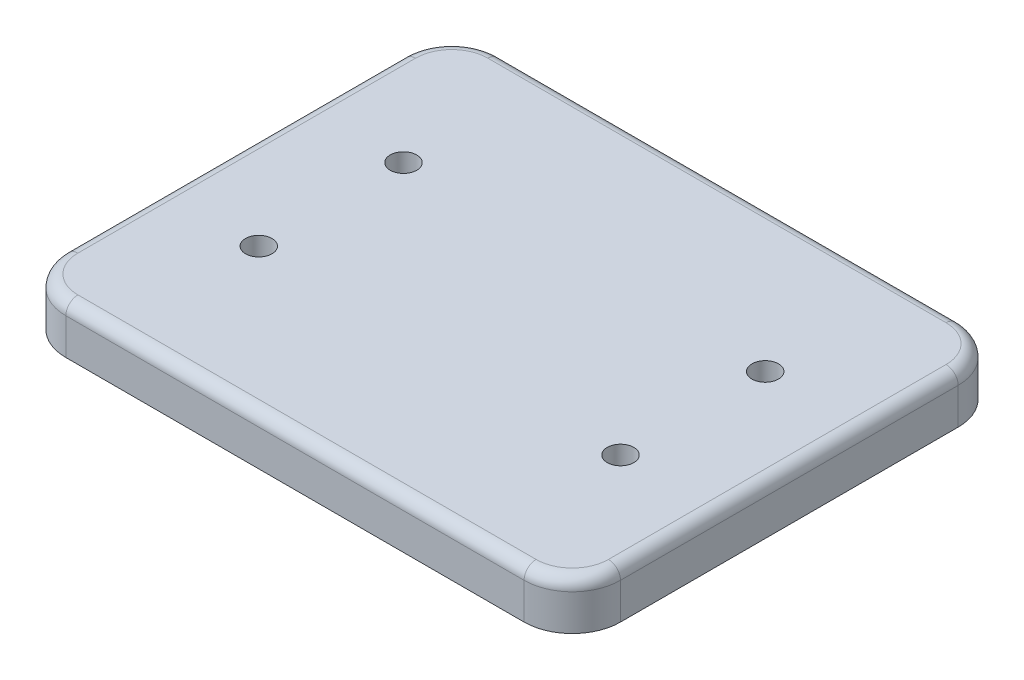
ISO-10303-21;
HEADER;
FILE_DESCRIPTION(('STEP AP214'),'2;1');
FILE_NAME('part.step','',(''),(''),'','','');
FILE_SCHEMA(('AUTOMOTIVE_DESIGN { 1 0 10303 214 1 1 1 1 }'));
ENDSEC;
DATA;
#1=APPLICATION_CONTEXT('core data for automotive mechanical design processes');
#2=APPLICATION_PROTOCOL_DEFINITION('international standard','automotive_design',2000,#1);
#3=PRODUCT_CONTEXT('',#1,'mechanical');
#4=PRODUCT('Part','Part','',(#3));
#5=PRODUCT_RELATED_PRODUCT_CATEGORY('part','',(#4));
#6=PRODUCT_DEFINITION_FORMATION('','',#4);
#7=PRODUCT_DEFINITION_CONTEXT('part definition',#1,'design');
#8=PRODUCT_DEFINITION('design','',#6,#7);
#9=PRODUCT_DEFINITION_SHAPE('','',#8);
#10=(LENGTH_UNIT() NAMED_UNIT(*) SI_UNIT(.MILLI.,.METRE.));
#11=(NAMED_UNIT(*) PLANE_ANGLE_UNIT() SI_UNIT($,.RADIAN.));
#12=(NAMED_UNIT(*) SI_UNIT($,.STERADIAN.) SOLID_ANGLE_UNIT());
#13=UNCERTAINTY_MEASURE_WITH_UNIT(LENGTH_MEASURE(1.E-05),#10,'distance_accuracy_value','');
#14=(GEOMETRIC_REPRESENTATION_CONTEXT(3) GLOBAL_UNCERTAINTY_ASSIGNED_CONTEXT((#13)) GLOBAL_UNIT_ASSIGNED_CONTEXT((#10,
#11,#12)) REPRESENTATION_CONTEXT('',''));
#15=CARTESIAN_POINT('',(0.,0.,0.));
#16=DIRECTION('',(0.,0.,1.));
#17=DIRECTION('',(1.,0.,0.));
#18=AXIS2_PLACEMENT_3D('',#15,#16,#17);
#19=CARTESIAN_POINT('',(-75.,20.,-30.));
#20=DIRECTION('',(0.,-1.,0.));
#21=DIRECTION('',(0.,0.,-1.));
#22=AXIS2_PLACEMENT_3D('',#19,#20,#21);
#23=CYLINDRICAL_SURFACE('',#22,5.49999999999999);
#24=CARTESIAN_POINT('',(-75.,20.,-30.));
#25=DIRECTION('',(0.,1.,0.));
#26=DIRECTION('',(0.,0.,1.));
#27=AXIS2_PLACEMENT_3D('',#24,#25,#26);
#28=CIRCLE('',#27,5.49999999999999);
#29=CARTESIAN_POINT('',(-75.,20.,-24.5));
#30=VERTEX_POINT('',#29);
#31=EDGE_CURVE('E146',#30,#30,#28,.T.);
#32=ORIENTED_EDGE('',*,*,#31,.T.);
#33=EDGE_LOOP('',(#32));
#34=FACE_BOUND('',#33,.T.);
#35=CARTESIAN_POINT('',(-75.,11.,-30.));
#36=DIRECTION('',(0.,-1.,0.));
#37=DIRECTION('',(0.,0.,-1.));
#38=AXIS2_PLACEMENT_3D('',#35,#36,#37);
#39=CIRCLE('',#38,5.49999999999999);
#40=CARTESIAN_POINT('',(-75.,11.,-35.5));
#41=VERTEX_POINT('',#40);
#42=EDGE_CURVE('E190',#41,#41,#39,.T.);
#43=ORIENTED_EDGE('',*,*,#42,.T.);
#44=EDGE_LOOP('',(#43));
#45=FACE_BOUND('',#44,.T.);
#46=ADVANCED_FACE('F36',(#34,#45),#23,.F.);
#47=CARTESIAN_POINT('',(75.,20.,-30.));
#48=DIRECTION('',(0.,-1.,0.));
#49=DIRECTION('',(0.,0.,-1.));
#50=AXIS2_PLACEMENT_3D('',#47,#48,#49);
#51=CYLINDRICAL_SURFACE('',#50,5.5);
#52=CARTESIAN_POINT('',(75.,20.,-30.));
#53=DIRECTION('',(0.,1.,0.));
#54=DIRECTION('',(0.,0.,1.));
#55=AXIS2_PLACEMENT_3D('',#52,#53,#54);
#56=CIRCLE('',#55,5.5);
#57=CARTESIAN_POINT('',(75.,20.,-24.5));
#58=VERTEX_POINT('',#57);
#59=EDGE_CURVE('E149',#58,#58,#56,.T.);
#60=ORIENTED_EDGE('',*,*,#59,.T.);
#61=EDGE_LOOP('',(#60));
#62=FACE_BOUND('',#61,.T.);
#63=CARTESIAN_POINT('',(75.,11.,-30.));
#64=DIRECTION('',(0.,-1.,0.));
#65=DIRECTION('',(0.,0.,-1.));
#66=AXIS2_PLACEMENT_3D('',#63,#64,#65);
#67=CIRCLE('',#66,5.5);
#68=CARTESIAN_POINT('',(75.,11.,-35.5));
#69=VERTEX_POINT('',#68);
#70=EDGE_CURVE('E187',#69,#69,#67,.T.);
#71=ORIENTED_EDGE('',*,*,#70,.T.);
#72=EDGE_LOOP('',(#71));
#73=FACE_BOUND('',#72,.T.);
#74=ADVANCED_FACE('F281',(#62,#73),#51,.F.);
#75=CARTESIAN_POINT('',(75.,20.,30.));
#76=DIRECTION('',(0.,-1.,0.));
#77=DIRECTION('',(0.,0.,-1.));
#78=AXIS2_PLACEMENT_3D('',#75,#76,#77);
#79=CYLINDRICAL_SURFACE('',#78,5.5);
#80=CARTESIAN_POINT('',(75.,20.,30.));
#81=DIRECTION('',(0.,1.,0.));
#82=DIRECTION('',(0.,0.,1.));
#83=AXIS2_PLACEMENT_3D('',#80,#81,#82);
#84=CIRCLE('',#83,5.5);
#85=CARTESIAN_POINT('',(75.,20.,35.5));
#86=VERTEX_POINT('',#85);
#87=EDGE_CURVE('E276',#86,#86,#84,.T.);
#88=ORIENTED_EDGE('',*,*,#87,.T.);
#89=EDGE_LOOP('',(#88));
#90=FACE_BOUND('',#89,.T.);
#91=CARTESIAN_POINT('',(75.,11.,30.));
#92=DIRECTION('',(0.,-1.,0.));
#93=DIRECTION('',(0.,0.,-1.));
#94=AXIS2_PLACEMENT_3D('',#91,#92,#93);
#95=CIRCLE('',#94,5.5);
#96=CARTESIAN_POINT('',(75.,11.,24.5));
#97=VERTEX_POINT('',#96);
#98=EDGE_CURVE('E183',#97,#97,#95,.T.);
#99=ORIENTED_EDGE('',*,*,#98,.T.);
#100=EDGE_LOOP('',(#99));
#101=FACE_BOUND('',#100,.T.);
#102=ADVANCED_FACE('F294',(#90,#101),#79,.F.);
#103=CARTESIAN_POINT('',(-75.,20.,30.));
#104=DIRECTION('',(0.,-1.,0.));
#105=DIRECTION('',(0.,0.,-1.));
#106=AXIS2_PLACEMENT_3D('',#103,#104,#105);
#107=CYLINDRICAL_SURFACE('',#106,5.49999999999999);
#108=CARTESIAN_POINT('',(-75.,20.,30.));
#109=DIRECTION('',(0.,1.,0.));
#110=DIRECTION('',(0.,0.,1.));
#111=AXIS2_PLACEMENT_3D('',#108,#109,#110);
#112=CIRCLE('',#111,5.49999999999999);
#113=CARTESIAN_POINT('',(-75.,20.,35.5));
#114=VERTEX_POINT('',#113);
#115=EDGE_CURVE('E193',#114,#114,#112,.T.);
#116=ORIENTED_EDGE('',*,*,#115,.T.);
#117=EDGE_LOOP('',(#116));
#118=FACE_BOUND('',#117,.T.);
#119=CARTESIAN_POINT('',(-75.,11.,30.));
#120=DIRECTION('',(0.,-1.,0.));
#121=DIRECTION('',(0.,0.,-1.));
#122=AXIS2_PLACEMENT_3D('',#119,#120,#121);
#123=CIRCLE('',#122,5.49999999999999);
#124=CARTESIAN_POINT('',(-75.,11.,24.5));
#125=VERTEX_POINT('',#124);
#126=EDGE_CURVE('E180',#125,#125,#123,.T.);
#127=ORIENTED_EDGE('',*,*,#126,.T.);
#128=EDGE_LOOP('',(#127));
#129=FACE_BOUND('',#128,.T.);
#130=ADVANCED_FACE('F287',(#118,#129),#107,.F.);
#131=CARTESIAN_POINT('',(95.,20.,70.));
#132=DIRECTION('',(0.,1.,0.));
#133=DIRECTION('',(0.,0.,1.));
#134=AXIS2_PLACEMENT_3D('',#131,#132,#133);
#135=PLANE('',#134);
#136=DIRECTION('',(0.,0.,1.));
#137=VECTOR('',#136,1.);
#138=CARTESIAN_POINT('',(-110.,20.,69.9999999999999));
#139=LINE('',#138,#137);
#140=CARTESIAN_POINT('',(-110.,20.,-69.9999999999998));
#141=VERTEX_POINT('',#140);
#142=CARTESIAN_POINT('',(-110.,20.,69.9999999999999));
#143=VERTEX_POINT('',#142);
#144=EDGE_CURVE('E205',#141,#143,#139,.T.);
#145=ORIENTED_EDGE('',*,*,#144,.T.);
#146=CARTESIAN_POINT('',(-94.9999999999999,20.,70.));
#147=DIRECTION('',(0.,1.,0.));
#148=DIRECTION('',(0.,0.,1.));
#149=AXIS2_PLACEMENT_3D('',#146,#147,#148);
#150=CIRCLE('',#149,15.);
#151=CARTESIAN_POINT('',(-94.9999999999998,20.,85.));
#152=VERTEX_POINT('',#151);
#153=EDGE_CURVE('E207',#143,#152,#150,.T.);
#154=ORIENTED_EDGE('',*,*,#153,.T.);
#155=DIRECTION('',(1.,0.,0.));
#156=VECTOR('',#155,1.);
#157=CARTESIAN_POINT('',(94.9999999999999,20.,85.));
#158=LINE('',#157,#156);
#159=CARTESIAN_POINT('',(94.9999999999999,20.,85.));
#160=VERTEX_POINT('',#159);
#161=EDGE_CURVE('E131',#152,#160,#158,.T.);
#162=ORIENTED_EDGE('',*,*,#161,.T.);
#163=CARTESIAN_POINT('',(95.,20.,70.));
#164=DIRECTION('',(0.,1.,0.));
#165=DIRECTION('',(0.,0.,1.));
#166=AXIS2_PLACEMENT_3D('',#163,#164,#165);
#167=CIRCLE('',#166,15.);
#168=CARTESIAN_POINT('',(110.,20.,69.9999999999998));
#169=VERTEX_POINT('',#168);
#170=EDGE_CURVE('E195',#160,#169,#167,.T.);
#171=ORIENTED_EDGE('',*,*,#170,.T.);
#172=DIRECTION('',(0.,0.,-1.));
#173=VECTOR('',#172,1.);
#174=CARTESIAN_POINT('',(110.,20.,-69.9999999999999));
#175=LINE('',#174,#173);
#176=CARTESIAN_POINT('',(110.,20.,-69.9999999999999));
#177=VERTEX_POINT('',#176);
#178=EDGE_CURVE('E197',#169,#177,#175,.T.);
#179=ORIENTED_EDGE('',*,*,#178,.T.);
#180=CARTESIAN_POINT('',(95.,20.,-70.));
#181=DIRECTION('',(0.,1.,0.));
#182=DIRECTION('',(0.,0.,1.));
#183=AXIS2_PLACEMENT_3D('',#180,#181,#182);
#184=CIRCLE('',#183,15.);
#185=CARTESIAN_POINT('',(94.9999999999999,20.,-85.));
#186=VERTEX_POINT('',#185);
#187=EDGE_CURVE('E199',#177,#186,#184,.T.);
#188=ORIENTED_EDGE('',*,*,#187,.T.);
#189=DIRECTION('',(-1.,0.,0.));
#190=VECTOR('',#189,1.);
#191=CARTESIAN_POINT('',(-94.9999999999998,20.,-85.));
#192=LINE('',#191,#190);
#193=CARTESIAN_POINT('',(-94.9999999999998,20.,-85.));
#194=VERTEX_POINT('',#193);
#195=EDGE_CURVE('E201',#186,#194,#192,.T.);
#196=ORIENTED_EDGE('',*,*,#195,.T.);
#197=CARTESIAN_POINT('',(-94.9999999999999,20.,-70.));
#198=DIRECTION('',(0.,1.,0.));
#199=DIRECTION('',(0.,0.,1.));
#200=AXIS2_PLACEMENT_3D('',#197,#198,#199);
#201=CIRCLE('',#200,15.);
#202=EDGE_CURVE('E203',#194,#141,#201,.T.);
#203=ORIENTED_EDGE('',*,*,#202,.T.);
#204=EDGE_LOOP('',(#145,#154,#162,#171,#179,#188,#196,#203));
#205=FACE_BOUND('',#204,.T.);
#206=ORIENTED_EDGE('',*,*,#87,.F.);
#207=EDGE_LOOP('',(#206));
#208=FACE_BOUND('',#207,.T.);
#209=ORIENTED_EDGE('',*,*,#31,.F.);
#210=EDGE_LOOP('',(#209));
#211=FACE_BOUND('',#210,.T.);
#212=ORIENTED_EDGE('',*,*,#59,.F.);
#213=EDGE_LOOP('',(#212));
#214=FACE_BOUND('',#213,.T.);
#215=ORIENTED_EDGE('',*,*,#115,.F.);
#216=EDGE_LOOP('',(#215));
#217=FACE_BOUND('',#216,.T.);
#218=ADVANCED_FACE('F284',(#205,#208,#211,#214,#217),#135,.T.);
#219=CARTESIAN_POINT('',(95.,0.,70.));
#220=DIRECTION('',(0.,1.,0.));
#221=DIRECTION('',(0.,0.,1.));
#222=AXIS2_PLACEMENT_3D('',#219,#220,#221);
#223=PLANE('',#222);
#224=CARTESIAN_POINT('',(-75.,0.,-30.));
#225=DIRECTION('',(0.,-1.,0.));
#226=DIRECTION('',(0.,0.,-1.));
#227=AXIS2_PLACEMENT_3D('',#224,#225,#226);
#228=CIRCLE('',#227,9.);
#229=CARTESIAN_POINT('',(-75.,0.,-39.));
#230=VERTEX_POINT('',#229);
#231=EDGE_CURVE('E262',#230,#230,#228,.T.);
#232=ORIENTED_EDGE('',*,*,#231,.F.);
#233=EDGE_LOOP('',(#232));
#234=FACE_BOUND('',#233,.T.);
#235=CARTESIAN_POINT('',(75.,0.,30.));
#236=DIRECTION('',(0.,-1.,0.));
#237=DIRECTION('',(0.,0.,-1.));
#238=AXIS2_PLACEMENT_3D('',#235,#236,#237);
#239=CIRCLE('',#238,9.00000000000001);
#240=CARTESIAN_POINT('',(75.,0.,21.));
#241=VERTEX_POINT('',#240);
#242=EDGE_CURVE('E255',#241,#241,#239,.T.);
#243=ORIENTED_EDGE('',*,*,#242,.F.);
#244=EDGE_LOOP('',(#243));
#245=FACE_BOUND('',#244,.T.);
#246=CARTESIAN_POINT('',(-75.,0.,30.));
#247=DIRECTION('',(0.,-1.,0.));
#248=DIRECTION('',(0.,0.,-1.));
#249=AXIS2_PLACEMENT_3D('',#246,#247,#248);
#250=CIRCLE('',#249,9.);
#251=CARTESIAN_POINT('',(-75.,0.,21.));
#252=VERTEX_POINT('',#251);
#253=EDGE_CURVE('E244',#252,#252,#250,.T.);
#254=ORIENTED_EDGE('',*,*,#253,.F.);
#255=EDGE_LOOP('',(#254));
#256=FACE_BOUND('',#255,.T.);
#257=CARTESIAN_POINT('',(75.,0.,-30.));
#258=DIRECTION('',(0.,-1.,0.));
#259=DIRECTION('',(0.,0.,-1.));
#260=AXIS2_PLACEMENT_3D('',#257,#258,#259);
#261=CIRCLE('',#260,9.00000000000001);
#262=CARTESIAN_POINT('',(75.,0.,-39.));
#263=VERTEX_POINT('',#262);
#264=EDGE_CURVE('E261',#263,#263,#261,.T.);
#265=ORIENTED_EDGE('',*,*,#264,.F.);
#266=EDGE_LOOP('',(#265));
#267=FACE_BOUND('',#266,.T.);
#268=CARTESIAN_POINT('',(95.,0.,70.));
#269=DIRECTION('',(0.,1.,0.));
#270=DIRECTION('',(0.,0.,1.));
#271=AXIS2_PLACEMENT_3D('',#268,#269,#270);
#272=CIRCLE('',#271,20.);
#273=CARTESIAN_POINT('',(94.9999999999999,0.,90.));
#274=VERTEX_POINT('',#273);
#275=CARTESIAN_POINT('',(115.,0.,69.9999999999998));
#276=VERTEX_POINT('',#275);
#277=EDGE_CURVE('E138',#274,#276,#272,.T.);
#278=ORIENTED_EDGE('',*,*,#277,.F.);
#279=DIRECTION('',(1.,0.,0.));
#280=VECTOR('',#279,1.);
#281=CARTESIAN_POINT('',(94.9999999999999,0.,90.));
#282=LINE('',#281,#280);
#283=CARTESIAN_POINT('',(-94.9999999999998,0.,90.));
#284=VERTEX_POINT('',#283);
#285=EDGE_CURVE('E166',#284,#274,#282,.T.);
#286=ORIENTED_EDGE('',*,*,#285,.F.);
#287=CARTESIAN_POINT('',(-94.9999999999999,0.,70.));
#288=DIRECTION('',(0.,1.,0.));
#289=DIRECTION('',(0.,0.,-1.));
#290=AXIS2_PLACEMENT_3D('',#287,#288,#289);
#291=CIRCLE('',#290,20.);
#292=CARTESIAN_POINT('',(-115.,0.,69.9999999999999));
#293=VERTEX_POINT('',#292);
#294=EDGE_CURVE('E163',#293,#284,#291,.T.);
#295=ORIENTED_EDGE('',*,*,#294,.F.);
#296=DIRECTION('',(0.,0.,1.));
#297=VECTOR('',#296,1.);
#298=CARTESIAN_POINT('',(-115.,0.,69.9999999999999));
#299=LINE('',#298,#297);
#300=CARTESIAN_POINT('',(-115.,0.,-69.9999999999998));
#301=VERTEX_POINT('',#300);
#302=EDGE_CURVE('E160',#301,#293,#299,.T.);
#303=ORIENTED_EDGE('',*,*,#302,.F.);
#304=CARTESIAN_POINT('',(-94.9999999999999,0.,-70.));
#305=DIRECTION('',(0.,1.,0.));
#306=DIRECTION('',(0.,0.,1.));
#307=AXIS2_PLACEMENT_3D('',#304,#305,#306);
#308=CIRCLE('',#307,20.);
#309=CARTESIAN_POINT('',(-94.9999999999998,0.,-90.));
#310=VERTEX_POINT('',#309);
#311=EDGE_CURVE('E157',#310,#301,#308,.T.);
#312=ORIENTED_EDGE('',*,*,#311,.F.);
#313=DIRECTION('',(-1.,0.,0.));
#314=VECTOR('',#313,1.);
#315=CARTESIAN_POINT('',(94.9999999999999,0.,-90.));
#316=LINE('',#315,#314);
#317=CARTESIAN_POINT('',(94.9999999999999,0.,-90.));
#318=VERTEX_POINT('',#317);
#319=EDGE_CURVE('E154',#318,#310,#316,.T.);
#320=ORIENTED_EDGE('',*,*,#319,.F.);
#321=CARTESIAN_POINT('',(95.,0.,-70.));
#322=DIRECTION('',(0.,1.,0.));
#323=DIRECTION('',(0.,0.,1.));
#324=AXIS2_PLACEMENT_3D('',#321,#322,#323);
#325=CIRCLE('',#324,20.);
#326=CARTESIAN_POINT('',(115.,0.,-69.9999999999999));
#327=VERTEX_POINT('',#326);
#328=EDGE_CURVE('E141',#327,#318,#325,.T.);
#329=ORIENTED_EDGE('',*,*,#328,.F.);
#330=DIRECTION('',(0.,0.,-1.));
#331=VECTOR('',#330,1.);
#332=CARTESIAN_POINT('',(115.,0.,69.9999999999998));
#333=LINE('',#332,#331);
#334=EDGE_CURVE('E127',#276,#327,#333,.T.);
#335=ORIENTED_EDGE('',*,*,#334,.F.);
#336=EDGE_LOOP('',(#278,#286,#295,#303,#312,#320,#329,#335));
#337=FACE_BOUND('',#336,.T.);
#338=ADVANCED_FACE('F136',(#234,#245,#256,#267,#337),#223,.F.);
#339=CARTESIAN_POINT('',(95.,20.,70.));
#340=DIRECTION('',(0.,-1.,0.));
#341=DIRECTION('',(0.,0.,-1.));
#342=AXIS2_PLACEMENT_3D('',#339,#340,#341);
#343=CYLINDRICAL_SURFACE('',#342,20.);
#344=DIRECTION('',(0.,-1.,0.));
#345=VECTOR('',#344,1.);
#346=CARTESIAN_POINT('',(115.,20.,69.9999999999998));
#347=LINE('',#346,#345);
#348=CARTESIAN_POINT('',(115.,15.,69.9999999999998));
#349=VERTEX_POINT('',#348);
#350=EDGE_CURVE('E124',#349,#276,#347,.T.);
#351=ORIENTED_EDGE('',*,*,#350,.F.);
#352=CARTESIAN_POINT('',(95.,15.,70.));
#353=DIRECTION('',(0.,1.,0.));
#354=DIRECTION('',(0.,0.,1.));
#355=AXIS2_PLACEMENT_3D('',#352,#353,#354);
#356=CIRCLE('',#355,20.);
#357=CARTESIAN_POINT('',(94.9999999999999,15.,90.));
#358=VERTEX_POINT('',#357);
#359=EDGE_CURVE('E45',#349,#358,#356,.F.);
#360=ORIENTED_EDGE('',*,*,#359,.T.);
#361=DIRECTION('',(0.,-1.,0.));
#362=VECTOR('',#361,1.);
#363=CARTESIAN_POINT('',(94.9999999999999,20.,90.));
#364=LINE('',#363,#362);
#365=EDGE_CURVE('E144',#358,#274,#364,.T.);
#366=ORIENTED_EDGE('',*,*,#365,.T.);
#367=ORIENTED_EDGE('',*,*,#277,.T.);
#368=EDGE_LOOP('',(#351,#360,#366,#367));
#369=FACE_BOUND('',#368,.T.);
#370=ADVANCED_FACE('F143',(#369),#343,.T.);
#371=CARTESIAN_POINT('',(115.,20.,69.9999999999998));
#372=DIRECTION('',(-1.,0.,0.));
#373=DIRECTION('',(0.,0.,1.));
#374=AXIS2_PLACEMENT_3D('',#371,#372,#373);
#375=PLANE('',#374);
#376=DIRECTION('',(0.,-1.,0.));
#377=VECTOR('',#376,1.);
#378=CARTESIAN_POINT('',(115.,20.,-69.9999999999999));
#379=LINE('',#378,#377);
#380=CARTESIAN_POINT('',(115.,15.,-69.9999999999999));
#381=VERTEX_POINT('',#380);
#382=EDGE_CURVE('E132',#381,#327,#379,.T.);
#383=ORIENTED_EDGE('',*,*,#382,.F.);
#384=DIRECTION('',(0.,0.,-1.));
#385=VECTOR('',#384,1.);
#386=CARTESIAN_POINT('',(115.,15.,69.9999999999998));
#387=LINE('',#386,#385);
#388=EDGE_CURVE('E60',#381,#349,#387,.F.);
#389=ORIENTED_EDGE('',*,*,#388,.T.);
#390=ORIENTED_EDGE('',*,*,#350,.T.);
#391=ORIENTED_EDGE('',*,*,#334,.T.);
#392=EDGE_LOOP('',(#383,#389,#390,#391));
#393=FACE_BOUND('',#392,.T.);
#394=ADVANCED_FACE('F126',(#393),#375,.F.);
#395=CARTESIAN_POINT('',(95.,20.,-70.));
#396=DIRECTION('',(0.,-1.,0.));
#397=DIRECTION('',(0.,0.,-1.));
#398=AXIS2_PLACEMENT_3D('',#395,#396,#397);
#399=CYLINDRICAL_SURFACE('',#398,20.);
#400=DIRECTION('',(0.,-1.,0.));
#401=VECTOR('',#400,1.);
#402=CARTESIAN_POINT('',(94.9999999999999,20.,-90.));
#403=LINE('',#402,#401);
#404=CARTESIAN_POINT('',(94.9999999999999,15.,-90.));
#405=VERTEX_POINT('',#404);
#406=EDGE_CURVE('E177',#405,#318,#403,.T.);
#407=ORIENTED_EDGE('',*,*,#406,.F.);
#408=CARTESIAN_POINT('',(95.,15.,-70.));
#409=DIRECTION('',(0.,1.,0.));
#410=DIRECTION('',(0.,0.,1.));
#411=AXIS2_PLACEMENT_3D('',#408,#409,#410);
#412=CIRCLE('',#411,20.);
#413=EDGE_CURVE('E219',#405,#381,#412,.F.);
#414=ORIENTED_EDGE('',*,*,#413,.T.);
#415=ORIENTED_EDGE('',*,*,#382,.T.);
#416=ORIENTED_EDGE('',*,*,#328,.T.);
#417=EDGE_LOOP('',(#407,#414,#415,#416));
#418=FACE_BOUND('',#417,.T.);
#419=ADVANCED_FACE('F343',(#418),#399,.T.);
#420=CARTESIAN_POINT('',(94.9999999999999,20.,-90.));
#421=DIRECTION('',(0.,0.,1.));
#422=DIRECTION('',(1.,0.,0.));
#423=AXIS2_PLACEMENT_3D('',#420,#421,#422);
#424=PLANE('',#423);
#425=DIRECTION('',(0.,-1.,0.));
#426=VECTOR('',#425,1.);
#427=CARTESIAN_POINT('',(-94.9999999999998,20.,-90.));
#428=LINE('',#427,#426);
#429=CARTESIAN_POINT('',(-94.9999999999998,15.,-90.));
#430=VERTEX_POINT('',#429);
#431=EDGE_CURVE('E175',#430,#310,#428,.T.);
#432=ORIENTED_EDGE('',*,*,#431,.F.);
#433=DIRECTION('',(-1.,0.,0.));
#434=VECTOR('',#433,1.);
#435=CARTESIAN_POINT('',(94.9999999999999,15.,-90.));
#436=LINE('',#435,#434);
#437=EDGE_CURVE('E217',#430,#405,#436,.F.);
#438=ORIENTED_EDGE('',*,*,#437,.T.);
#439=ORIENTED_EDGE('',*,*,#406,.T.);
#440=ORIENTED_EDGE('',*,*,#319,.T.);
#441=EDGE_LOOP('',(#432,#438,#439,#440));
#442=FACE_BOUND('',#441,.T.);
#443=ADVANCED_FACE('F339',(#442),#424,.F.);
#444=CARTESIAN_POINT('',(-94.9999999999999,20.,-70.));
#445=DIRECTION('',(0.,-1.,0.));
#446=DIRECTION('',(0.,0.,-1.));
#447=AXIS2_PLACEMENT_3D('',#444,#445,#446);
#448=CYLINDRICAL_SURFACE('',#447,20.);
#449=DIRECTION('',(0.,-1.,0.));
#450=VECTOR('',#449,1.);
#451=CARTESIAN_POINT('',(-115.,20.,-69.9999999999998));
#452=LINE('',#451,#450);
#453=CARTESIAN_POINT('',(-115.,15.,-69.9999999999998));
#454=VERTEX_POINT('',#453);
#455=EDGE_CURVE('E173',#454,#301,#452,.T.);
#456=ORIENTED_EDGE('',*,*,#455,.F.);
#457=CARTESIAN_POINT('',(-94.9999999999999,15.,-70.));
#458=DIRECTION('',(0.,1.,0.));
#459=DIRECTION('',(0.,0.,1.));
#460=AXIS2_PLACEMENT_3D('',#457,#458,#459);
#461=CIRCLE('',#460,20.);
#462=EDGE_CURVE('E215',#454,#430,#461,.F.);
#463=ORIENTED_EDGE('',*,*,#462,.T.);
#464=ORIENTED_EDGE('',*,*,#431,.T.);
#465=ORIENTED_EDGE('',*,*,#311,.T.);
#466=EDGE_LOOP('',(#456,#463,#464,#465));
#467=FACE_BOUND('',#466,.T.);
#468=ADVANCED_FACE('F335',(#467),#448,.T.);
#469=CARTESIAN_POINT('',(-115.,20.,69.9999999999999));
#470=DIRECTION('',(1.,0.,0.));
#471=DIRECTION('',(0.,0.,-1.));
#472=AXIS2_PLACEMENT_3D('',#469,#470,#471);
#473=PLANE('',#472);
#474=DIRECTION('',(0.,-1.,0.));
#475=VECTOR('',#474,1.);
#476=CARTESIAN_POINT('',(-115.,20.,69.9999999999999));
#477=LINE('',#476,#475);
#478=CARTESIAN_POINT('',(-115.,15.,69.9999999999999));
#479=VERTEX_POINT('',#478);
#480=EDGE_CURVE('E171',#479,#293,#477,.T.);
#481=ORIENTED_EDGE('',*,*,#480,.F.);
#482=DIRECTION('',(0.,0.,1.));
#483=VECTOR('',#482,1.);
#484=CARTESIAN_POINT('',(-115.,15.,-69.9999999999998));
#485=LINE('',#484,#483);
#486=EDGE_CURVE('E213',#479,#454,#485,.F.);
#487=ORIENTED_EDGE('',*,*,#486,.T.);
#488=ORIENTED_EDGE('',*,*,#455,.T.);
#489=ORIENTED_EDGE('',*,*,#302,.T.);
#490=EDGE_LOOP('',(#481,#487,#488,#489));
#491=FACE_BOUND('',#490,.T.);
#492=ADVANCED_FACE('F331',(#491),#473,.F.);
#493=CARTESIAN_POINT('',(-94.9999999999999,20.,70.));
#494=DIRECTION('',(0.,-1.,0.));
#495=DIRECTION('',(0.,0.,-1.));
#496=AXIS2_PLACEMENT_3D('',#493,#494,#495);
#497=CYLINDRICAL_SURFACE('',#496,20.);
#498=DIRECTION('',(0.,-1.,0.));
#499=VECTOR('',#498,1.);
#500=CARTESIAN_POINT('',(-94.9999999999998,20.,90.));
#501=LINE('',#500,#499);
#502=CARTESIAN_POINT('',(-94.9999999999998,15.,90.));
#503=VERTEX_POINT('',#502);
#504=EDGE_CURVE('E169',#503,#284,#501,.T.);
#505=ORIENTED_EDGE('',*,*,#504,.F.);
#506=CARTESIAN_POINT('',(-94.9999999999999,15.,70.));
#507=DIRECTION('',(0.,1.,0.));
#508=DIRECTION('',(0.,0.,1.));
#509=AXIS2_PLACEMENT_3D('',#506,#507,#508);
#510=CIRCLE('',#509,20.);
#511=EDGE_CURVE('E210',#503,#479,#510,.F.);
#512=ORIENTED_EDGE('',*,*,#511,.T.);
#513=ORIENTED_EDGE('',*,*,#480,.T.);
#514=ORIENTED_EDGE('',*,*,#294,.T.);
#515=EDGE_LOOP('',(#505,#512,#513,#514));
#516=FACE_BOUND('',#515,.T.);
#517=ADVANCED_FACE('F312',(#516),#497,.T.);
#518=CARTESIAN_POINT('',(94.9999999999999,20.,90.));
#519=DIRECTION('',(0.,0.,-1.));
#520=DIRECTION('',(-1.,0.,0.));
#521=AXIS2_PLACEMENT_3D('',#518,#519,#520);
#522=PLANE('',#521);
#523=ORIENTED_EDGE('',*,*,#365,.F.);
#524=DIRECTION('',(1.,0.,0.));
#525=VECTOR('',#524,1.);
#526=CARTESIAN_POINT('',(-94.9999999999998,15.,90.));
#527=LINE('',#526,#525);
#528=EDGE_CURVE('E11',#358,#503,#527,.F.);
#529=ORIENTED_EDGE('',*,*,#528,.T.);
#530=ORIENTED_EDGE('',*,*,#504,.T.);
#531=ORIENTED_EDGE('',*,*,#285,.T.);
#532=EDGE_LOOP('',(#523,#529,#530,#531));
#533=FACE_BOUND('',#532,.T.);
#534=ADVANCED_FACE('F307',(#533),#522,.F.);
#535=CARTESIAN_POINT('',(-75.,11.,30.));
#536=DIRECTION('',(0.,-1.,0.));
#537=DIRECTION('',(0.,0.,-1.));
#538=AXIS2_PLACEMENT_3D('',#535,#536,#537);
#539=CYLINDRICAL_SURFACE('',#538,9.);
#540=CARTESIAN_POINT('',(-75.,11.,30.));
#541=DIRECTION('',(0.,-1.,0.));
#542=DIRECTION('',(0.,0.,-1.));
#543=AXIS2_PLACEMENT_3D('',#540,#541,#542);
#544=CIRCLE('',#543,9.);
#545=CARTESIAN_POINT('',(-75.,11.,21.));
#546=VERTEX_POINT('',#545);
#547=EDGE_CURVE('E250',#546,#546,#544,.T.);
#548=ORIENTED_EDGE('',*,*,#547,.F.);
#549=EDGE_LOOP('',(#548));
#550=FACE_BOUND('',#549,.T.);
#551=ORIENTED_EDGE('',*,*,#253,.T.);
#552=EDGE_LOOP('',(#551));
#553=FACE_BOUND('',#552,.T.);
#554=ADVANCED_FACE('F302',(#550,#553),#539,.F.);
#555=CARTESIAN_POINT('',(-75.,11.,30.));
#556=DIRECTION('',(0.,-1.,0.));
#557=DIRECTION('',(0.,0.,-1.));
#558=AXIS2_PLACEMENT_3D('',#555,#556,#557);
#559=PLANE('',#558);
#560=ORIENTED_EDGE('',*,*,#126,.F.);
#561=EDGE_LOOP('',(#560));
#562=FACE_BOUND('',#561,.T.);
#563=ORIENTED_EDGE('',*,*,#547,.T.);
#564=EDGE_LOOP('',(#563));
#565=FACE_BOUND('',#564,.T.);
#566=ADVANCED_FACE('F298',(#562,#565),#559,.T.);
#567=CARTESIAN_POINT('',(75.,11.,30.));
#568=DIRECTION('',(0.,-1.,0.));
#569=DIRECTION('',(0.,0.,-1.));
#570=AXIS2_PLACEMENT_3D('',#567,#568,#569);
#571=CYLINDRICAL_SURFACE('',#570,9.00000000000001);
#572=CARTESIAN_POINT('',(75.,11.,30.));
#573=DIRECTION('',(0.,-1.,0.));
#574=DIRECTION('',(0.,0.,-1.));
#575=AXIS2_PLACEMENT_3D('',#572,#573,#574);
#576=CIRCLE('',#575,9.00000000000001);
#577=CARTESIAN_POINT('',(75.,11.,21.));
#578=VERTEX_POINT('',#577);
#579=EDGE_CURVE('E265',#578,#578,#576,.T.);
#580=ORIENTED_EDGE('',*,*,#579,.F.);
#581=EDGE_LOOP('',(#580));
#582=FACE_BOUND('',#581,.T.);
#583=ORIENTED_EDGE('',*,*,#242,.T.);
#584=EDGE_LOOP('',(#583));
#585=FACE_BOUND('',#584,.T.);
#586=ADVANCED_FACE('F301',(#582,#585),#571,.F.);
#587=CARTESIAN_POINT('',(75.,11.,30.));
#588=DIRECTION('',(0.,-1.,0.));
#589=DIRECTION('',(0.,0.,-1.));
#590=AXIS2_PLACEMENT_3D('',#587,#588,#589);
#591=PLANE('',#590);
#592=ORIENTED_EDGE('',*,*,#98,.F.);
#593=EDGE_LOOP('',(#592));
#594=FACE_BOUND('',#593,.T.);
#595=ORIENTED_EDGE('',*,*,#579,.T.);
#596=EDGE_LOOP('',(#595));
#597=FACE_BOUND('',#596,.T.);
#598=ADVANCED_FACE('F419',(#594,#597),#591,.T.);
#599=CARTESIAN_POINT('',(75.,11.,-30.));
#600=DIRECTION('',(0.,-1.,0.));
#601=DIRECTION('',(0.,0.,-1.));
#602=AXIS2_PLACEMENT_3D('',#599,#600,#601);
#603=CYLINDRICAL_SURFACE('',#602,9.00000000000001);
#604=CARTESIAN_POINT('',(75.,11.,-30.));
#605=DIRECTION('',(0.,-1.,0.));
#606=DIRECTION('',(0.,0.,-1.));
#607=AXIS2_PLACEMENT_3D('',#604,#605,#606);
#608=CIRCLE('',#607,9.00000000000001);
#609=CARTESIAN_POINT('',(75.,11.,-39.));
#610=VERTEX_POINT('',#609);
#611=EDGE_CURVE('E184',#610,#610,#608,.T.);
#612=ORIENTED_EDGE('',*,*,#611,.F.);
#613=EDGE_LOOP('',(#612));
#614=FACE_BOUND('',#613,.T.);
#615=ORIENTED_EDGE('',*,*,#264,.T.);
#616=EDGE_LOOP('',(#615));
#617=FACE_BOUND('',#616,.T.);
#618=ADVANCED_FACE('F422',(#614,#617),#603,.F.);
#619=CARTESIAN_POINT('',(75.,11.,-30.));
#620=DIRECTION('',(0.,-1.,0.));
#621=DIRECTION('',(0.,0.,-1.));
#622=AXIS2_PLACEMENT_3D('',#619,#620,#621);
#623=PLANE('',#622);
#624=ORIENTED_EDGE('',*,*,#70,.F.);
#625=EDGE_LOOP('',(#624));
#626=FACE_BOUND('',#625,.T.);
#627=ORIENTED_EDGE('',*,*,#611,.T.);
#628=EDGE_LOOP('',(#627));
#629=FACE_BOUND('',#628,.T.);
#630=ADVANCED_FACE('F436',(#626,#629),#623,.T.);
#631=CARTESIAN_POINT('',(-75.,11.,-30.));
#632=DIRECTION('',(0.,-1.,0.));
#633=DIRECTION('',(0.,0.,-1.));
#634=AXIS2_PLACEMENT_3D('',#631,#632,#633);
#635=CYLINDRICAL_SURFACE('',#634,9.);
#636=CARTESIAN_POINT('',(-75.,11.,-30.));
#637=DIRECTION('',(0.,-1.,0.));
#638=DIRECTION('',(0.,0.,-1.));
#639=AXIS2_PLACEMENT_3D('',#636,#637,#638);
#640=CIRCLE('',#639,9.);
#641=CARTESIAN_POINT('',(-75.,11.,-39.));
#642=VERTEX_POINT('',#641);
#643=EDGE_CURVE('E258',#642,#642,#640,.T.);
#644=ORIENTED_EDGE('',*,*,#643,.F.);
#645=EDGE_LOOP('',(#644));
#646=FACE_BOUND('',#645,.T.);
#647=ORIENTED_EDGE('',*,*,#231,.T.);
#648=EDGE_LOOP('',(#647));
#649=FACE_BOUND('',#648,.T.);
#650=ADVANCED_FACE('F384',(#646,#649),#635,.F.);
#651=CARTESIAN_POINT('',(-75.,11.,-30.));
#652=DIRECTION('',(0.,-1.,0.));
#653=DIRECTION('',(0.,0.,-1.));
#654=AXIS2_PLACEMENT_3D('',#651,#652,#653);
#655=PLANE('',#654);
#656=ORIENTED_EDGE('',*,*,#42,.F.);
#657=EDGE_LOOP('',(#656));
#658=FACE_BOUND('',#657,.T.);
#659=ORIENTED_EDGE('',*,*,#643,.T.);
#660=EDGE_LOOP('',(#659));
#661=FACE_BOUND('',#660,.T.);
#662=ADVANCED_FACE('F379',(#658,#661),#655,.T.);
#663=CARTESIAN_POINT('',(95.,15.,-70.));
#664=DIRECTION('',(0.,1.,0.));
#665=DIRECTION('',(0.,0.,1.));
#666=AXIS2_PLACEMENT_3D('',#663,#664,#665);
#667=TOROIDAL_SURFACE('',#666,15.,5.);
#668=CARTESIAN_POINT('',(110.,15.,-69.9999999999999));
#669=DIRECTION('',(0.,0.,1.));
#670=DIRECTION('',(1.,0.,0.));
#671=AXIS2_PLACEMENT_3D('',#668,#669,#670);
#672=CIRCLE('',#671,5.);
#673=EDGE_CURVE('E238',#381,#177,#672,.T.);
#674=ORIENTED_EDGE('',*,*,#673,.F.);
#675=ORIENTED_EDGE('',*,*,#413,.F.);
#676=CARTESIAN_POINT('',(94.9999999999999,15.,-85.));
#677=DIRECTION('',(-1.,0.,0.));
#678=DIRECTION('',(0.,0.,1.));
#679=AXIS2_PLACEMENT_3D('',#676,#677,#678);
#680=CIRCLE('',#679,5.);
#681=EDGE_CURVE('E40',#186,#405,#680,.T.);
#682=ORIENTED_EDGE('',*,*,#681,.F.);
#683=ORIENTED_EDGE('',*,*,#187,.F.);
#684=EDGE_LOOP('',(#674,#675,#682,#683));
#685=FACE_BOUND('',#684,.T.);
#686=ADVANCED_FACE('F38',(#685),#667,.T.);
#687=CARTESIAN_POINT('',(95.,15.,-85.));
#688=DIRECTION('',(1.,0.,0.));
#689=DIRECTION('',(0.,0.,-1.));
#690=AXIS2_PLACEMENT_3D('',#687,#688,#689);
#691=CYLINDRICAL_SURFACE('',#690,5.);
#692=ORIENTED_EDGE('',*,*,#681,.T.);
#693=ORIENTED_EDGE('',*,*,#437,.F.);
#694=CARTESIAN_POINT('',(-94.9999999999998,15.,-85.));
#695=DIRECTION('',(-1.,0.,0.));
#696=DIRECTION('',(0.,0.,1.));
#697=AXIS2_PLACEMENT_3D('',#694,#695,#696);
#698=CIRCLE('',#697,5.);
#699=EDGE_CURVE('E236',#194,#430,#698,.T.);
#700=ORIENTED_EDGE('',*,*,#699,.F.);
#701=ORIENTED_EDGE('',*,*,#195,.F.);
#702=EDGE_LOOP('',(#692,#693,#700,#701));
#703=FACE_BOUND('',#702,.T.);
#704=ADVANCED_FACE('F374',(#703),#691,.T.);
#705=CARTESIAN_POINT('',(110.,15.,70.));
#706=DIRECTION('',(0.,0.,1.));
#707=DIRECTION('',(1.,0.,0.));
#708=AXIS2_PLACEMENT_3D('',#705,#706,#707);
#709=CYLINDRICAL_SURFACE('',#708,5.);
#710=ORIENTED_EDGE('',*,*,#673,.T.);
#711=ORIENTED_EDGE('',*,*,#178,.F.);
#712=CARTESIAN_POINT('',(110.,15.,69.9999999999998));
#713=DIRECTION('',(0.,0.,1.));
#714=DIRECTION('',(1.,0.,0.));
#715=AXIS2_PLACEMENT_3D('',#712,#713,#714);
#716=CIRCLE('',#715,5.);
#717=EDGE_CURVE('E233',#349,#169,#716,.T.);
#718=ORIENTED_EDGE('',*,*,#717,.F.);
#719=ORIENTED_EDGE('',*,*,#388,.F.);
#720=EDGE_LOOP('',(#710,#711,#718,#719));
#721=FACE_BOUND('',#720,.T.);
#722=ADVANCED_FACE('F371',(#721),#709,.T.);
#723=CARTESIAN_POINT('',(-94.9999999999999,15.,-70.));
#724=DIRECTION('',(0.,1.,0.));
#725=DIRECTION('',(0.,0.,1.));
#726=AXIS2_PLACEMENT_3D('',#723,#724,#725);
#727=TOROIDAL_SURFACE('',#726,15.,5.);
#728=ORIENTED_EDGE('',*,*,#699,.T.);
#729=ORIENTED_EDGE('',*,*,#462,.F.);
#730=CARTESIAN_POINT('',(-110.,15.,-69.9999999999998));
#731=DIRECTION('',(0.,0.,1.));
#732=DIRECTION('',(1.,0.,0.));
#733=AXIS2_PLACEMENT_3D('',#730,#731,#732);
#734=CIRCLE('',#733,5.);
#735=EDGE_CURVE('E230',#141,#454,#734,.T.);
#736=ORIENTED_EDGE('',*,*,#735,.F.);
#737=ORIENTED_EDGE('',*,*,#202,.F.);
#738=EDGE_LOOP('',(#728,#729,#736,#737));
#739=FACE_BOUND('',#738,.T.);
#740=ADVANCED_FACE('F367',(#739),#727,.T.);
#741=CARTESIAN_POINT('',(95.,15.,70.));
#742=DIRECTION('',(0.,1.,0.));
#743=DIRECTION('',(0.,0.,1.));
#744=AXIS2_PLACEMENT_3D('',#741,#742,#743);
#745=TOROIDAL_SURFACE('',#744,15.,5.);
#746=ORIENTED_EDGE('',*,*,#717,.T.);
#747=ORIENTED_EDGE('',*,*,#170,.F.);
#748=CARTESIAN_POINT('',(94.9999999999999,15.,85.));
#749=DIRECTION('',(-1.,0.,0.));
#750=DIRECTION('',(0.,0.,1.));
#751=AXIS2_PLACEMENT_3D('',#748,#749,#750);
#752=CIRCLE('',#751,5.);
#753=EDGE_CURVE('E227',#358,#160,#752,.T.);
#754=ORIENTED_EDGE('',*,*,#753,.F.);
#755=ORIENTED_EDGE('',*,*,#359,.F.);
#756=EDGE_LOOP('',(#746,#747,#754,#755));
#757=FACE_BOUND('',#756,.T.);
#758=ADVANCED_FACE('F363',(#757),#745,.T.);
#759=CARTESIAN_POINT('',(-110.,15.,70.));
#760=DIRECTION('',(0.,0.,-1.));
#761=DIRECTION('',(-1.,0.,0.));
#762=AXIS2_PLACEMENT_3D('',#759,#760,#761);
#763=CYLINDRICAL_SURFACE('',#762,5.);
#764=ORIENTED_EDGE('',*,*,#735,.T.);
#765=ORIENTED_EDGE('',*,*,#486,.F.);
#766=CARTESIAN_POINT('',(-110.,15.,69.9999999999999));
#767=DIRECTION('',(0.,0.,1.));
#768=DIRECTION('',(1.,0.,0.));
#769=AXIS2_PLACEMENT_3D('',#766,#767,#768);
#770=CIRCLE('',#769,5.);
#771=EDGE_CURVE('E225',#143,#479,#770,.T.);
#772=ORIENTED_EDGE('',*,*,#771,.F.);
#773=ORIENTED_EDGE('',*,*,#144,.F.);
#774=EDGE_LOOP('',(#764,#765,#772,#773));
#775=FACE_BOUND('',#774,.T.);
#776=ADVANCED_FACE('F359',(#775),#763,.T.);
#777=CARTESIAN_POINT('',(95.,15.,85.));
#778=DIRECTION('',(-1.,0.,0.));
#779=DIRECTION('',(0.,0.,1.));
#780=AXIS2_PLACEMENT_3D('',#777,#778,#779);
#781=CYLINDRICAL_SURFACE('',#780,5.);
#782=ORIENTED_EDGE('',*,*,#753,.T.);
#783=ORIENTED_EDGE('',*,*,#161,.F.);
#784=CARTESIAN_POINT('',(-94.9999999999998,15.,85.));
#785=DIRECTION('',(-1.,0.,0.));
#786=DIRECTION('',(0.,-1.,0.));
#787=AXIS2_PLACEMENT_3D('',#784,#785,#786);
#788=CIRCLE('',#787,5.);
#789=EDGE_CURVE('E223',#503,#152,#788,.T.);
#790=ORIENTED_EDGE('',*,*,#789,.F.);
#791=ORIENTED_EDGE('',*,*,#528,.F.);
#792=EDGE_LOOP('',(#782,#783,#790,#791));
#793=FACE_BOUND('',#792,.T.);
#794=ADVANCED_FACE('F355',(#793),#781,.T.);
#795=CARTESIAN_POINT('',(-94.9999999999999,15.,70.));
#796=DIRECTION('',(0.,1.,0.));
#797=DIRECTION('',(0.,0.,1.));
#798=AXIS2_PLACEMENT_3D('',#795,#796,#797);
#799=TOROIDAL_SURFACE('',#798,15.,5.);
#800=ORIENTED_EDGE('',*,*,#771,.T.);
#801=ORIENTED_EDGE('',*,*,#511,.F.);
#802=ORIENTED_EDGE('',*,*,#789,.T.);
#803=ORIENTED_EDGE('',*,*,#153,.F.);
#804=EDGE_LOOP('',(#800,#801,#802,#803));
#805=FACE_BOUND('',#804,.T.);
#806=ADVANCED_FACE('F352',(#805),#799,.T.);
#807=CLOSED_SHELL('',(#46,#74,#102,#130,#218,#338,#370,#394,#419,#443,#468,#492,#517,#534,#554,
#566,#586,#598,#618,#630,#650,#662,#686,#704,#722,#740,#758,#776,#794,#806));
#808=MANIFOLD_SOLID_BREP('B2',#807);
#809=ADVANCED_BREP_SHAPE_REPRESENTATION('',(#18,#808),#14);
#810=SHAPE_DEFINITION_REPRESENTATION(#9,#809);
ENDSEC;
END-ISO-10303-21;
